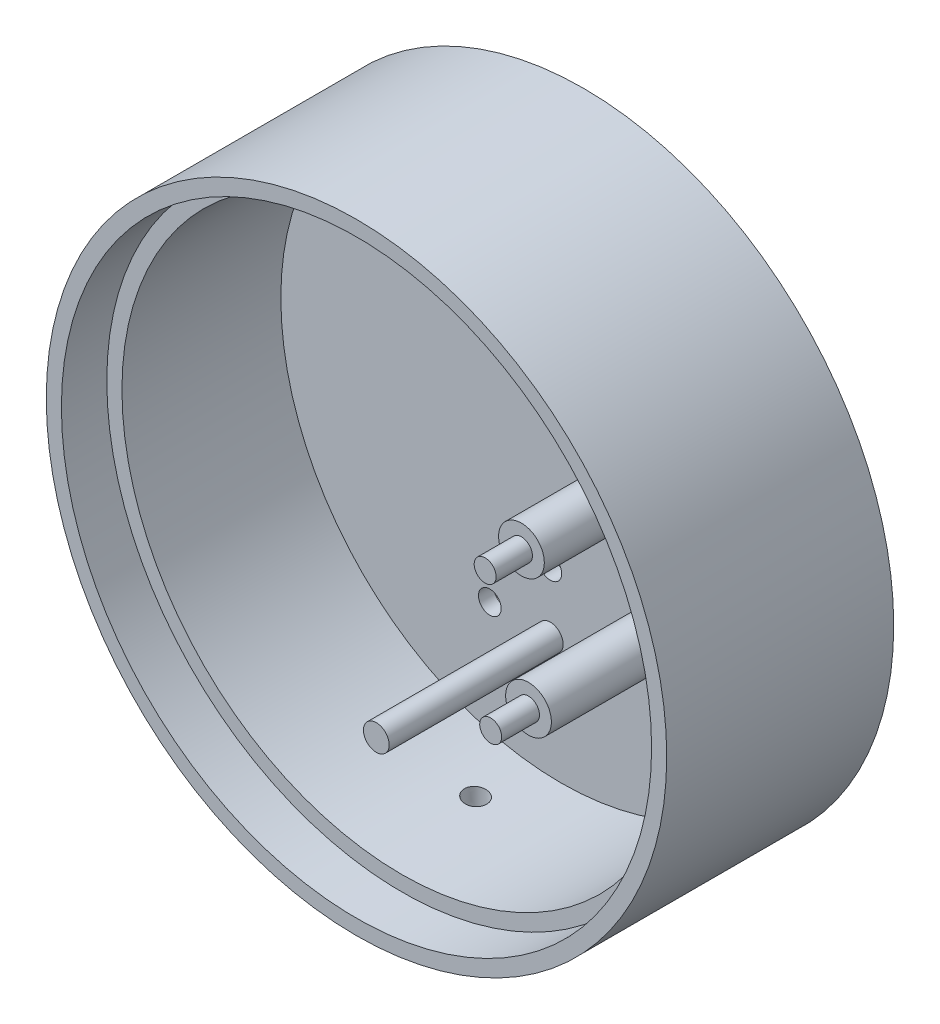
ISO-10303-21;
HEADER;
FILE_DESCRIPTION(('STEP AP214'),'2;1');
FILE_NAME('part.step','',(''),(''),'','','');
FILE_SCHEMA(('AUTOMOTIVE_DESIGN { 1 0 10303 214 1 1 1 1 }'));
ENDSEC;
DATA;
#1=APPLICATION_CONTEXT('core data for automotive mechanical design processes');
#2=APPLICATION_PROTOCOL_DEFINITION('international standard','automotive_design',2000,#1);
#3=PRODUCT_CONTEXT('',#1,'mechanical');
#4=PRODUCT('Part','Part','',(#3));
#5=PRODUCT_RELATED_PRODUCT_CATEGORY('part','',(#4));
#6=PRODUCT_DEFINITION_FORMATION('','',#4);
#7=PRODUCT_DEFINITION_CONTEXT('part definition',#1,'design');
#8=PRODUCT_DEFINITION('design','',#6,#7);
#9=PRODUCT_DEFINITION_SHAPE('','',#8);
#10=(LENGTH_UNIT() NAMED_UNIT(*) SI_UNIT(.MILLI.,.METRE.));
#11=(NAMED_UNIT(*) PLANE_ANGLE_UNIT() SI_UNIT($,.RADIAN.));
#12=(NAMED_UNIT(*) SI_UNIT($,.STERADIAN.) SOLID_ANGLE_UNIT());
#13=UNCERTAINTY_MEASURE_WITH_UNIT(LENGTH_MEASURE(1.E-05),#10,'distance_accuracy_value','');
#14=(GEOMETRIC_REPRESENTATION_CONTEXT(3) GLOBAL_UNCERTAINTY_ASSIGNED_CONTEXT((#13)) GLOBAL_UNIT_ASSIGNED_CONTEXT((#10,
#11,#12)) REPRESENTATION_CONTEXT('',''));
#15=CARTESIAN_POINT('',(0.,0.,0.));
#16=DIRECTION('',(0.,0.,1.));
#17=DIRECTION('',(1.,0.,0.));
#18=AXIS2_PLACEMENT_3D('',#15,#16,#17);
#19=CARTESIAN_POINT('',(0.,0.,30.));
#20=DIRECTION('',(0.,0.,-1.));
#21=DIRECTION('',(-1.,0.,0.));
#22=AXIS2_PLACEMENT_3D('',#19,#20,#21);
#23=CYLINDRICAL_SURFACE('',#22,41.);
#24=CARTESIAN_POINT('',(0.,0.,30.));
#25=DIRECTION('',(0.,0.,1.));
#26=DIRECTION('',(1.,0.,0.));
#27=AXIS2_PLACEMENT_3D('',#24,#25,#26);
#28=CIRCLE('',#27,41.);
#29=CARTESIAN_POINT('',(41.,0.,30.));
#30=VERTEX_POINT('',#29);
#31=EDGE_CURVE('E62',#30,#30,#28,.T.);
#32=ORIENTED_EDGE('',*,*,#31,.F.);
#33=EDGE_LOOP('',(#32));
#34=FACE_BOUND('',#33,.T.);
#35=CARTESIAN_POINT('',(0.,0.,0.));
#36=DIRECTION('',(0.,0.,1.));
#37=DIRECTION('',(1.,0.,0.));
#38=AXIS2_PLACEMENT_3D('',#35,#36,#37);
#39=CIRCLE('',#38,41.);
#40=CARTESIAN_POINT('',(41.,0.,0.));
#41=VERTEX_POINT('',#40);
#42=EDGE_CURVE('E141',#41,#41,#39,.T.);
#43=ORIENTED_EDGE('',*,*,#42,.T.);
#44=EDGE_LOOP('',(#43));
#45=FACE_BOUND('',#44,.T.);
#46=CARTESIAN_POINT('',(-2.37716467658597,-40.931028427104,10.4137086346441));
#47=CARTESIAN_POINT('',(-2.3771623971837,-40.9310284511238,10.3717192586367));
#48=CARTESIAN_POINT('',(-2.37889073852028,-40.9309281414088,10.329746946571));
#49=CARTESIAN_POINT('',(-2.38928220916009,-40.9303237648442,10.2039738746951));
#50=CARTESIAN_POINT('',(-2.40316975808611,-40.9295152008504,10.1205363014389));
#51=CARTESIAN_POINT('',(-2.44448005674494,-40.9270684764169,9.95730723749149));
#52=CARTESIAN_POINT('',(-2.47187756123256,-40.9254318631553,9.87750924841363));
#53=CARTESIAN_POINT('',(-2.53928052711791,-40.9213047530433,9.72408262746924));
#54=CARTESIAN_POINT('',(-2.5791989464474,-40.9188201410525,9.65041571773568));
#55=CARTESIAN_POINT('',(-2.6703102887617,-40.9129747375921,9.51132421389357));
#56=CARTESIAN_POINT('',(-2.72140769674994,-40.9096213270637,9.44583676221509));
#57=CARTESIAN_POINT('',(-2.83325525378671,-40.9020264981456,9.32480100142182));
#58=CARTESIAN_POINT('',(-2.89391858940833,-40.8977929664996,9.26917204182055));
#59=CARTESIAN_POINT('',(-3.02309162520389,-40.8884466493802,9.16918447918071));
#60=CARTESIAN_POINT('',(-3.09153574303989,-40.8833410538152,9.12474053635474));
#61=CARTESIAN_POINT('',(-3.23436214556599,-40.8722888207287,9.04810110652717));
#62=CARTESIAN_POINT('',(-3.30870508266276,-40.8663475805962,9.01583155996949));
#63=CARTESIAN_POINT('',(-3.46137228195058,-40.8536992414531,8.96420456445859));
#64=CARTESIAN_POINT('',(-3.53968044197045,-40.8469951205884,8.94479879528864));
#65=CARTESIAN_POINT('',(-3.69829646602468,-40.8329393204402,8.91928340327016));
#66=CARTESIAN_POINT('',(-3.77860224228909,-40.8255882984099,8.91316044369928));
#67=CARTESIAN_POINT('',(-3.93906944754786,-40.810418118415,8.9143339874341));
#68=CARTESIAN_POINT('',(-4.01923087785729,-40.8025989647377,8.92163036785733));
#69=CARTESIAN_POINT('',(-4.17720822656224,-40.7867286829846,8.94940002343128));
#70=CARTESIAN_POINT('',(-4.25502420601022,-40.7786775609575,8.96987295528351));
#71=CARTESIAN_POINT('',(-4.40621251656862,-40.762618592802,9.02337405445755));
#72=CARTESIAN_POINT('',(-4.47958501646807,-40.7546107450402,9.05640174452981));
#73=CARTESIAN_POINT('',(-4.619943731995,-40.7389385490923,9.13403507326682));
#74=CARTESIAN_POINT('',(-4.68693022837092,-40.7312741858134,9.17864020263036));
#75=CARTESIAN_POINT('',(-4.81282579759617,-40.7165903377375,9.27820688968569));
#76=CARTESIAN_POINT('',(-4.87173522771201,-40.7095708244219,9.33316798905453));
#77=CARTESIAN_POINT('',(-4.95286170306225,-40.6997531503153,9.42215355724027));
#78=CARTESIAN_POINT('',(-4.97870128755044,-40.6965987250306,9.4529117405157));
#79=CARTESIAN_POINT('',(-5.02785985428536,-40.6905546476847,9.51644911921834));
#80=CARTESIAN_POINT('',(-5.05117660347693,-40.6876652305311,9.54923006541931));
#81=CARTESIAN_POINT('',(-5.11763603799433,-40.6793782884215,9.65110580188371));
#82=CARTESIAN_POINT('',(-5.15662696943926,-40.6744427386298,9.72300809800538));
#83=CARTESIAN_POINT('',(-5.22255257164166,-40.6660307793524,9.8722242573391));
#84=CARTESIAN_POINT('',(-5.24948613464754,-40.6625545039371,9.94953861702166));
#85=CARTESIAN_POINT('',(-5.28061018950195,-40.6585201710797,10.0689460091167));
#86=CARTESIAN_POINT('',(-5.28948803442309,-40.6573655022343,10.109847041171));
#87=CARTESIAN_POINT('',(-5.30385510434942,-40.6554937584518,10.1922100948839));
#88=CARTESIAN_POINT('',(-5.30934740520797,-40.654776286317,10.2336715722546));
#89=CARTESIAN_POINT('',(-5.32069075693438,-40.65329417879,10.358555483994));
#90=CARTESIAN_POINT('',(-5.32141694373462,-40.6531987177451,10.4425108714224));
#91=CARTESIAN_POINT('',(-5.30914634308201,-40.6548028823739,10.6093540287983));
#92=CARTESIAN_POINT('',(-5.29614951753959,-40.6565025130301,10.6922417957821));
#93=CARTESIAN_POINT('',(-5.25677352408483,-40.6616124139497,10.8547344130826));
#94=CARTESIAN_POINT('',(-5.23039418558919,-40.6650227060185,10.9343392215385));
#95=CARTESIAN_POINT('',(-5.16497542737987,-40.6733832940348,11.0879420153035));
#96=CARTESIAN_POINT('',(-5.12595429336044,-40.678331365247,11.161947909571));
#97=CARTESIAN_POINT('',(-5.03647383611218,-40.6895065968907,11.302070250108));
#98=CARTESIAN_POINT('',(-4.98607155253496,-40.6957273647341,11.3682236115034));
#99=CARTESIAN_POINT('',(-4.87537244106547,-40.7091368791797,11.4908187098025));
#100=CARTESIAN_POINT('',(-4.81513696903969,-40.7163195766707,11.5473164827921));
#101=CARTESIAN_POINT('',(-4.68657706406967,-40.7313165506159,11.6491212629628));
#102=CARTESIAN_POINT('',(-4.61830913101037,-40.7391263057909,11.6945002425527));
#103=CARTESIAN_POINT('',(-4.4756609180233,-40.7550434799205,11.7729643258045));
#104=CARTESIAN_POINT('',(-4.4013239590787,-40.763148593773,11.8061286019149));
#105=CARTESIAN_POINT('',(-4.2485973380533,-40.7793486809919,11.8594368278455));
#106=CARTESIAN_POINT('',(-4.17023330354311,-40.787443446941,11.8796542047419));
#107=CARTESIAN_POINT('',(-4.01152531937639,-40.8033576642224,11.9066915835615));
#108=CARTESIAN_POINT('',(-3.93119060501075,-40.811178092281,11.9135651650779));
#109=CARTESIAN_POINT('',(-3.77058452554266,-40.826329585603,11.9138474115494));
#110=CARTESIAN_POINT('',(-3.69031327562182,-40.833661439309,11.9072783411759));
#111=CARTESIAN_POINT('',(-3.53191956964451,-40.8476666150801,11.8808963126063));
#112=CARTESIAN_POINT('',(-3.45379710413857,-40.8543399400413,11.8610834126609));
#113=CARTESIAN_POINT('',(-3.30185137902421,-40.8669009558953,11.8087916497526));
#114=CARTESIAN_POINT('',(-3.22802801689039,-40.8727886655278,11.7763130889838));
#115=CARTESIAN_POINT('',(-3.08667874348646,-40.8837063579864,11.6996407978586));
#116=CARTESIAN_POINT('',(-3.0191525769953,-40.8887363755811,11.65544754257));
#117=CARTESIAN_POINT('',(-2.89217621932528,-40.8979140746058,11.5566195361865));
#118=CARTESIAN_POINT('',(-2.83272560953991,-40.9020618017768,11.5019853266651));
#119=CARTESIAN_POINT('',(-2.72341222811634,-40.9094858692467,11.3838069769244));
#120=CARTESIAN_POINT('',(-2.67354891651546,-40.9127622586239,11.3202633388384));
#121=CARTESIAN_POINT('',(-2.58463087265841,-40.9184759411256,11.1859986411743));
#122=CARTESIAN_POINT('',(-2.54557555889166,-40.9209132793959,11.1152779680273));
#123=CARTESIAN_POINT('',(-2.4791928832257,-40.9249888911003,10.9685038678597));
#124=CARTESIAN_POINT('',(-2.45186499224826,-40.9266272005827,10.8924506815934));
#125=CARTESIAN_POINT('',(-2.41295019395358,-40.9289381994663,10.7494611280361));
#126=CARTESIAN_POINT('',(-2.39954442424727,-40.9297234409867,10.6830128116031));
#127=CARTESIAN_POINT('',(-2.3816561004512,-40.9307683823227,10.5489306611682));
#128=CARTESIAN_POINT('',(-2.37716834566425,-40.93102838844,10.4812975413361));
#129=CARTESIAN_POINT('',(-2.37716467658597,-40.931028427104,10.4137086346441));
#130=B_SPLINE_CURVE_WITH_KNOTS('',3,(#46,#47,#48,#49,#50,#51,#52,#53,#54,#55,#56,#57,#58,#59,
#60,#61,#62,#63,#64,#65,#66,#67,#68,#69,#70,#71,#72,#73,#74,#75,#76,#77,#78,#79,#80,#81,#82,#83,
#84,#85,#86,#87,#88,#89,#90,#91,#92,#93,#94,#95,#96,#97,#98,#99,#100,#101,#102,#103,#104,#105,
#106,#107,#108,#109,#110,#111,#112,#113,#114,#115,#116,#117,#118,#119,#120,#121,#122,#123,#124,
#125,#126,#127,#128,#129),.UNSPECIFIED.,.T.,.F.,(4,2,2,2,2,2,2,2,2,2,2,2,2,2,2,2,2,2,2,2,2,2,2,
2,2,2,2,2,2,2,2,2,2,2,2,2,2,2,2,2,2,4),(0.,0.125920881562001,0.378415016122451,
0.630439107837695,0.880748637745167,1.12899765782723,1.37511124865286,1.61928585213772,
1.86195017255385,2.1036977281542,2.34520244242334,2.58670494521665,2.82820115622057,
3.06968818804063,3.31116459844458,3.55263032436428,3.67340346574219,3.79428264815385,
4.03895998274571,4.28365979206833,4.40914064828536,4.53450733325827,4.78513817085038,
5.03576970409462,5.28640443215162,5.5366782368112,5.78572452207218,6.03327239984255,
6.27917284426694,6.52345014441489,6.76632948481489,7.00823155348009,7.24973329111297,
7.49123396655081,7.7327288802991,7.97421400216583,8.21568660157064,8.45714559710021,
8.69859159870891,8.9400267064277,9.14283568181152,9.34552635082659),.UNSPECIFIED.);
#131=CARTESIAN_POINT('',(-2.37716467658597,-40.931028427104,10.4137086346441));
#132=VERTEX_POINT('',#131);
#133=EDGE_CURVE('E298',#132,#132,#130,.T.);
#134=ORIENTED_EDGE('',*,*,#133,.T.);
#135=EDGE_LOOP('',(#134));
#136=FACE_BOUND('',#135,.T.);
#137=ADVANCED_FACE('F47',(#34,#45,#136),#23,.T.);
#138=CARTESIAN_POINT('',(0.,0.,24.));
#139=DIRECTION('',(0.,0.,-1.));
#140=DIRECTION('',(-1.,0.,0.));
#141=AXIS2_PLACEMENT_3D('',#138,#139,#140);
#142=CYLINDRICAL_SURFACE('',#141,37.);
#143=CARTESIAN_POINT('',(0.,0.,24.));
#144=DIRECTION('',(0.,0.,1.));
#145=DIRECTION('',(1.,0.,0.));
#146=AXIS2_PLACEMENT_3D('',#143,#144,#145);
#147=CIRCLE('',#146,37.);
#148=CARTESIAN_POINT('',(37.,0.,24.));
#149=VERTEX_POINT('',#148);
#150=EDGE_CURVE('E134',#149,#149,#147,.T.);
#151=ORIENTED_EDGE('',*,*,#150,.T.);
#152=EDGE_LOOP('',(#151));
#153=FACE_BOUND('',#152,.T.);
#154=CARTESIAN_POINT('',(0.,0.,3.));
#155=DIRECTION('',(0.,0.,1.));
#156=DIRECTION('',(1.,0.,0.));
#157=AXIS2_PLACEMENT_3D('',#154,#155,#156);
#158=CIRCLE('',#157,37.);
#159=CARTESIAN_POINT('',(37.,0.,3.));
#160=VERTEX_POINT('',#159);
#161=EDGE_CURVE('E12',#160,#160,#158,.T.);
#162=ORIENTED_EDGE('',*,*,#161,.F.);
#163=EDGE_LOOP('',(#162));
#164=FACE_BOUND('',#163,.T.);
#165=CARTESIAN_POINT('',(-2.37716467658597,-36.9235573597722,10.4137086346441));
#166=CARTESIAN_POINT('',(-2.37716271417179,-36.9235573779669,10.3717348926635));
#167=CARTESIAN_POINT('',(-2.3788896553615,-36.9234462635655,10.3297763583407));
#168=CARTESIAN_POINT('',(-2.38927359312985,-36.922776764497,10.2040456025513));
#169=CARTESIAN_POINT('',(-2.4031516678805,-36.9218810609903,10.1206374955645));
#170=CARTESIAN_POINT('',(-2.44443285583983,-36.9191706942836,9.95746408194085));
#171=CARTESIAN_POINT('',(-2.47181098644721,-36.9173577283677,9.87769234276516));
#172=CARTESIAN_POINT('',(-2.53916697514021,-36.9127858443964,9.72430986820282));
#173=CARTESIAN_POINT('',(-2.57905893940528,-36.9100333640597,9.65066133821899));
#174=CARTESIAN_POINT('',(-2.67011271795926,-36.9035575062899,9.51159431483901));
#175=CARTESIAN_POINT('',(-2.72118074123011,-36.8998421641621,9.44611405642221));
#176=CARTESIAN_POINT('',(-2.83297073939447,-36.891426978505,9.32507761129766));
#177=CARTESIAN_POINT('',(-2.89360816267674,-36.8867356525065,9.26944280436401));
#178=CARTESIAN_POINT('',(-3.02273840206351,-36.8763773762121,9.16942781241244));
#179=CARTESIAN_POINT('',(-3.09116821617957,-36.8707180876059,9.12496554466447));
#180=CARTESIAN_POINT('',(-3.23398354905525,-36.8584651127971,9.048276773632));
#181=CARTESIAN_POINT('',(-3.30833221054481,-36.8518770382874,9.01598077743316));
#182=CARTESIAN_POINT('',(-3.46103509539099,-36.8378486117338,8.96429565495821));
#183=CARTESIAN_POINT('',(-3.53937511838574,-36.8304111782741,8.94486380149455));
#184=CARTESIAN_POINT('',(-3.69808098620725,-36.8148142551436,8.9193022393244));
#185=CARTESIAN_POINT('',(-3.77844566980221,-36.8066551729184,8.91316507366161));
#186=CARTESIAN_POINT('',(-3.93902057343224,-36.7898169897099,8.91432786231537));
#187=CARTESIAN_POINT('',(-4.01923079529094,-36.7811378949054,8.92162765700613));
#188=CARTESIAN_POINT('',(-4.17729757149612,-36.7635214810976,8.94941842671122));
#189=CARTESIAN_POINT('',(-4.25515419097057,-36.754584169253,8.96990903636397));
#190=CARTESIAN_POINT('',(-4.40641672586458,-36.7367567441652,9.02345625610048));
#191=CARTESIAN_POINT('',(-4.47982281040511,-36.7278666291401,9.05651238834511));
#192=CARTESIAN_POINT('',(-4.62025214938032,-36.7104655668306,9.13422662951711));
#193=CARTESIAN_POINT('',(-4.68727567238551,-36.7019546036,9.17888424997275));
#194=CARTESIAN_POINT('',(-4.81321805473752,-36.6856507459434,9.27854641786288));
#195=CARTESIAN_POINT('',(-4.87213724271229,-36.6778578224054,9.33355054553585));
#196=CARTESIAN_POINT('',(-4.98039024215024,-36.6633154853591,9.45240784599249));
#197=CARTESIAN_POINT('',(-5.02972438905974,-36.6565660353342,9.51626070896419));
#198=CARTESIAN_POINT('',(-5.11758896699633,-36.6444027962827,9.65111981000824));
#199=CARTESIAN_POINT('',(-5.15611969320282,-36.6389889707638,9.72212585256383));
#200=CARTESIAN_POINT('',(-5.22143724016742,-36.6297377282479,9.86944040049489));
#201=CARTESIAN_POINT('',(-5.24822428622059,-36.6259002810094,9.94574880411539));
#202=CARTESIAN_POINT('',(-5.2894061134526,-36.6199756818038,10.1017017581762));
#203=CARTESIAN_POINT('',(-5.30380103863482,-36.6178885094976,10.1813462698379));
#204=CARTESIAN_POINT('',(-5.31984978648091,-36.6155604270779,10.3419369565512));
#205=CARTESIAN_POINT('',(-5.3215036718657,-36.6153195078757,10.4228831251932));
#206=CARTESIAN_POINT('',(-5.31203629832251,-36.6166941726344,10.5839995938832));
#207=CARTESIAN_POINT('',(-5.30091502340757,-36.6183097589185,10.66416989296));
#208=CARTESIAN_POINT('',(-5.26614442489883,-36.6233263138505,10.8217291838974));
#209=CARTESIAN_POINT('',(-5.24249500648972,-36.6267272960105,10.8991181547036));
#210=CARTESIAN_POINT('',(-5.19810868270545,-36.6330435942676,11.0115150130964));
#211=CARTESIAN_POINT('',(-5.18182412532248,-36.6353520250639,11.0483725292445));
#212=CARTESIAN_POINT('',(-5.14636453340583,-36.6403500802995,11.1206857588619));
#213=CARTESIAN_POINT('',(-5.12718685589277,-36.6430400531569,11.1561401527488));
#214=CARTESIAN_POINT('',(-5.06496097127197,-36.6517113272265,11.2608925242604));
#215=CARTESIAN_POINT('',(-5.01759052451856,-36.6582405902685,11.3276396906477));
#216=CARTESIAN_POINT('',(-4.91265586659724,-36.6724501651519,11.4524348660254));
#217=CARTESIAN_POINT('',(-4.85509178223605,-36.6801304626745,11.5104829832135));
#218=CARTESIAN_POINT('',(-4.76180562963885,-36.6923181899025,11.5902055530761));
#219=CARTESIAN_POINT('',(-4.72926699001965,-36.6965281129651,11.6157271666187));
#220=CARTESIAN_POINT('',(-4.66220613453742,-36.7051083302985,11.6639144718032));
#221=CARTESIAN_POINT('',(-4.62768574973725,-36.7094784752221,11.6865827399112));
#222=CARTESIAN_POINT('',(-4.52247298784255,-36.7226382958959,11.7494628279695));
#223=CARTESIAN_POINT('',(-4.44916323144803,-36.7316044673991,11.7853725701244));
#224=CARTESIAN_POINT('',(-4.29806521048729,-36.7495903701681,11.8442489655035));
#225=CARTESIAN_POINT('',(-4.2203057586637,-36.7586094781549,11.8672903523326));
#226=CARTESIAN_POINT('',(-4.0623620930821,-36.7763986027129,11.9000026224893));
#227=CARTESIAN_POINT('',(-3.98219073266402,-36.7851695771154,11.9097347489451));
#228=CARTESIAN_POINT('',(-3.82150258412264,-36.8022095762224,11.9156934454065));
#229=CARTESIAN_POINT('',(-3.74098719645508,-36.8104798228351,11.9119543609791));
#230=CARTESIAN_POINT('',(-3.58162967486224,-36.8263267493941,11.8911334482267));
#231=CARTESIAN_POINT('',(-3.50278754559527,-36.8339034274097,11.8740515827607));
#232=CARTESIAN_POINT('',(-3.34895732629295,-36.8482083244286,11.8270347218515));
#233=CARTESIAN_POINT('',(-3.27396917164101,-36.85493655766,11.797099941982));
#234=CARTESIAN_POINT('',(-3.12989193857024,-36.8674519202014,11.725247732099));
#235=CARTESIAN_POINT('',(-3.06080265546402,-36.8732390821724,11.6833307180817));
#236=CARTESIAN_POINT('',(-2.93037140732863,-36.8838340250799,11.5887369934332));
#237=CARTESIAN_POINT('',(-2.86902907061677,-36.8886418530097,11.536060799323));
#238=CARTESIAN_POINT('',(-2.75564912510584,-36.897284956876,11.4213960992488));
#239=CARTESIAN_POINT('',(-2.70361100787976,-36.9011202859592,11.3594081024668));
#240=CARTESIAN_POINT('',(-2.63356285805986,-36.9061633783724,11.2608219339488));
#241=CARTESIAN_POINT('',(-2.61154559204897,-36.9077262747324,11.2270203197484));
#242=CARTESIAN_POINT('',(-2.57026707297282,-36.9106238660287,11.157723143987));
#243=CARTESIAN_POINT('',(-2.55100834148069,-36.9119583523902,11.1222260716291));
#244=CARTESIAN_POINT('',(-2.49713901948488,-36.9156554147511,11.0126609120286));
#245=CARTESIAN_POINT('',(-2.46700388788924,-36.9176713366705,10.9363196354663));
#246=CARTESIAN_POINT('',(-2.41939204458254,-36.9208222480713,10.7798170538286));
#247=CARTESIAN_POINT('',(-2.40191409767279,-36.9219573235143,10.6996561223225));
#248=CARTESIAN_POINT('',(-2.38177318943043,-36.9232614803444,10.5507113280389));
#249=CARTESIAN_POINT('',(-2.37716787830896,-36.9235573300873,10.4821897409694));
#250=CARTESIAN_POINT('',(-2.37716467658597,-36.9235573597722,10.4137086346441));
#251=B_SPLINE_CURVE_WITH_KNOTS('',3,(#165,#166,#167,#168,#169,#170,#171,#172,#173,#174,#175,
#176,#177,#178,#179,#180,#181,#182,#183,#184,#185,#186,#187,#188,#189,#190,#191,#192,#193,#194,
#195,#196,#197,#198,#199,#200,#201,#202,#203,#204,#205,#206,#207,#208,#209,#210,#211,#212,#213,
#214,#215,#216,#217,#218,#219,#220,#221,#222,#223,#224,#225,#226,#227,#228,#229,#230,#231,#232,
#233,#234,#235,#236,#237,#238,#239,#240,#241,#242,#243,#244,#245,#246,#247,#248,#249,#250),
.UNSPECIFIED.,.T.,.F.,(4,2,2,2,2,2,2,2,2,2,2,2,2,2,2,2,2,2,2,2,2,2,2,2,2,2,2,2,2,2,2,2,2,2,2,2,
2,2,2,2,2,2,4),(0.,0.125877356085569,0.378284248894425,0.630225791885029,0.880474534461168,
1.12869861605412,1.37484103820202,1.61911842726084,1.86197856577792,2.10402796241475,
2.3459415589749,2.5878522817157,2.82975630425792,3.07165112864321,3.31353576988357,
3.55541059989284,3.79727696351773,4.03913671803872,4.28099183243037,4.52284413629224,
4.76469524957562,5.00654666551435,5.2483999118555,5.36937028115445,5.49045183846915,
5.73561458877269,5.9807742895173,6.10534706839655,6.22980654317309,6.47494813991078,
6.71865085314831,6.96122834132997,7.20318780348839,7.44514793916793,7.68710401676528,
7.92905169521309,8.17098776109133,8.41291060238333,8.53390858133001,8.65501646802656,
8.90014646630251,9.14525253942594,9.35062428374265),.UNSPECIFIED.);
#252=CARTESIAN_POINT('',(-2.37716467658597,-36.9235573597722,10.4137086346441));
#253=VERTEX_POINT('',#252);
#254=EDGE_CURVE('E291',#253,#253,#251,.T.);
#255=ORIENTED_EDGE('',*,*,#254,.F.);
#256=EDGE_LOOP('',(#255));
#257=FACE_BOUND('',#256,.T.);
#258=ADVANCED_FACE('F174',(#153,#164,#257),#142,.F.);
#259=CARTESIAN_POINT('',(-1.38249356231057,-29.,0.));
#260=DIRECTION('',(0.,0.,1.));
#261=DIRECTION('',(1.,0.,0.));
#262=AXIS2_PLACEMENT_3D('',#259,#260,#261);
#263=CYLINDRICAL_SURFACE('',#262,1.5);
#264=CARTESIAN_POINT('',(-1.38249356231057,-29.,3.));
#265=DIRECTION('',(0.,0.,1.));
#266=DIRECTION('',(1.,0.,0.));
#267=AXIS2_PLACEMENT_3D('',#264,#265,#266);
#268=CIRCLE('',#267,1.5);
#269=CARTESIAN_POINT('',(0.11750643768943,-29.,3.));
#270=VERTEX_POINT('',#269);
#271=EDGE_CURVE('E93',#270,#270,#268,.T.);
#272=ORIENTED_EDGE('',*,*,#271,.T.);
#273=EDGE_LOOP('',(#272));
#274=FACE_BOUND('',#273,.T.);
#275=CARTESIAN_POINT('',(-1.38249356231057,-29.,1.));
#276=DIRECTION('',(0.,0.,-1.));
#277=DIRECTION('',(-1.,0.,0.));
#278=AXIS2_PLACEMENT_3D('',#275,#276,#277);
#279=CIRCLE('',#278,1.5);
#280=CARTESIAN_POINT('',(-2.88249356231057,-29.,1.));
#281=VERTEX_POINT('',#280);
#282=EDGE_CURVE('E51',#281,#281,#279,.F.);
#283=ORIENTED_EDGE('',*,*,#282,.F.);
#284=EDGE_LOOP('',(#283));
#285=FACE_BOUND('',#284,.T.);
#286=ADVANCED_FACE('F180',(#274,#285),#263,.F.);
#287=CARTESIAN_POINT('',(-9.38249356231057,-21.,0.));
#288=DIRECTION('',(0.,0.,1.));
#289=DIRECTION('',(1.,0.,0.));
#290=AXIS2_PLACEMENT_3D('',#287,#288,#289);
#291=CYLINDRICAL_SURFACE('',#290,1.5);
#292=CARTESIAN_POINT('',(-9.38249356231057,-21.,3.));
#293=DIRECTION('',(0.,0.,1.));
#294=DIRECTION('',(1.,0.,0.));
#295=AXIS2_PLACEMENT_3D('',#292,#293,#294);
#296=CIRCLE('',#295,1.5);
#297=CARTESIAN_POINT('',(-7.88249356231057,-21.,3.));
#298=VERTEX_POINT('',#297);
#299=EDGE_CURVE('E98',#298,#298,#296,.T.);
#300=ORIENTED_EDGE('',*,*,#299,.T.);
#301=EDGE_LOOP('',(#300));
#302=FACE_BOUND('',#301,.T.);
#303=CARTESIAN_POINT('',(-9.38249356231057,-21.,1.));
#304=DIRECTION('',(0.,0.,-1.));
#305=DIRECTION('',(-1.,0.,0.));
#306=AXIS2_PLACEMENT_3D('',#303,#304,#305);
#307=CIRCLE('',#306,1.5);
#308=CARTESIAN_POINT('',(-10.8824935623106,-21.,1.));
#309=VERTEX_POINT('',#308);
#310=EDGE_CURVE('E86',#309,#309,#307,.F.);
#311=ORIENTED_EDGE('',*,*,#310,.F.);
#312=EDGE_LOOP('',(#311));
#313=FACE_BOUND('',#312,.T.);
#314=ADVANCED_FACE('F189',(#302,#313),#291,.F.);
#315=CARTESIAN_POINT('',(-1.38249356231057,-13.,0.));
#316=DIRECTION('',(0.,0.,1.));
#317=DIRECTION('',(1.,0.,0.));
#318=AXIS2_PLACEMENT_3D('',#315,#316,#317);
#319=CYLINDRICAL_SURFACE('',#318,1.5);
#320=CARTESIAN_POINT('',(-1.38249356231057,-13.,3.));
#321=DIRECTION('',(0.,0.,1.));
#322=DIRECTION('',(1.,0.,0.));
#323=AXIS2_PLACEMENT_3D('',#320,#321,#322);
#324=CIRCLE('',#323,1.5);
#325=CARTESIAN_POINT('',(0.117506437689427,-13.,3.));
#326=VERTEX_POINT('',#325);
#327=EDGE_CURVE('E104',#326,#326,#324,.T.);
#328=ORIENTED_EDGE('',*,*,#327,.T.);
#329=EDGE_LOOP('',(#328));
#330=FACE_BOUND('',#329,.T.);
#331=CARTESIAN_POINT('',(-1.38249356231057,-13.,1.));
#332=DIRECTION('',(0.,0.,-1.));
#333=DIRECTION('',(-1.,0.,0.));
#334=AXIS2_PLACEMENT_3D('',#331,#332,#333);
#335=CIRCLE('',#334,1.5);
#336=CARTESIAN_POINT('',(-2.88249356231057,-13.,1.));
#337=VERTEX_POINT('',#336);
#338=EDGE_CURVE('E82',#337,#337,#335,.F.);
#339=ORIENTED_EDGE('',*,*,#338,.F.);
#340=EDGE_LOOP('',(#339));
#341=FACE_BOUND('',#340,.T.);
#342=ADVANCED_FACE('F239',(#330,#341),#319,.F.);
#343=CARTESIAN_POINT('',(6.61750643768943,-21.,0.));
#344=DIRECTION('',(0.,0.,1.));
#345=DIRECTION('',(1.,0.,0.));
#346=AXIS2_PLACEMENT_3D('',#343,#344,#345);
#347=CYLINDRICAL_SURFACE('',#346,1.5);
#348=CARTESIAN_POINT('',(6.61750643768943,-21.,3.));
#349=DIRECTION('',(0.,0.,1.));
#350=DIRECTION('',(1.,0.,0.));
#351=AXIS2_PLACEMENT_3D('',#348,#349,#350);
#352=CIRCLE('',#351,1.5);
#353=CARTESIAN_POINT('',(8.11750643768943,-21.,3.));
#354=VERTEX_POINT('',#353);
#355=EDGE_CURVE('E115',#354,#354,#352,.T.);
#356=ORIENTED_EDGE('',*,*,#355,.T.);
#357=EDGE_LOOP('',(#356));
#358=FACE_BOUND('',#357,.T.);
#359=CARTESIAN_POINT('',(6.61750643768943,-21.,1.));
#360=DIRECTION('',(0.,0.,-1.));
#361=DIRECTION('',(-1.,0.,0.));
#362=AXIS2_PLACEMENT_3D('',#359,#360,#361);
#363=CIRCLE('',#362,1.5);
#364=CARTESIAN_POINT('',(5.11750643768943,-21.,1.));
#365=VERTEX_POINT('',#364);
#366=EDGE_CURVE('E78',#365,#365,#363,.F.);
#367=ORIENTED_EDGE('',*,*,#366,.F.);
#368=EDGE_LOOP('',(#367));
#369=FACE_BOUND('',#368,.T.);
#370=ADVANCED_FACE('F243',(#358,#369),#347,.F.);
#371=CARTESIAN_POINT('',(0.,0.,30.));
#372=DIRECTION('',(0.,0.,-1.));
#373=DIRECTION('',(-1.,0.,0.));
#374=AXIS2_PLACEMENT_3D('',#371,#372,#373);
#375=CYLINDRICAL_SURFACE('',#374,39.);
#376=CARTESIAN_POINT('',(0.,0.,24.));
#377=DIRECTION('',(0.,0.,1.));
#378=DIRECTION('',(1.,0.,0.));
#379=AXIS2_PLACEMENT_3D('',#376,#377,#378);
#380=CIRCLE('',#379,39.);
#381=CARTESIAN_POINT('',(39.,0.,24.));
#382=VERTEX_POINT('',#381);
#383=EDGE_CURVE('E56',#382,#382,#380,.T.);
#384=ORIENTED_EDGE('',*,*,#383,.F.);
#385=EDGE_LOOP('',(#384));
#386=FACE_BOUND('',#385,.T.);
#387=CARTESIAN_POINT('',(0.,0.,30.));
#388=DIRECTION('',(0.,0.,1.));
#389=DIRECTION('',(1.,0.,0.));
#390=AXIS2_PLACEMENT_3D('',#387,#388,#389);
#391=CIRCLE('',#390,39.);
#392=CARTESIAN_POINT('',(39.,0.,30.));
#393=VERTEX_POINT('',#392);
#394=EDGE_CURVE('E142',#393,#393,#391,.T.);
#395=ORIENTED_EDGE('',*,*,#394,.T.);
#396=EDGE_LOOP('',(#395));
#397=FACE_BOUND('',#396,.T.);
#398=ADVANCED_FACE('F49',(#386,#397),#375,.F.);
#399=CARTESIAN_POINT('',(0.,0.,30.));
#400=DIRECTION('',(0.,0.,1.));
#401=DIRECTION('',(1.,0.,0.));
#402=AXIS2_PLACEMENT_3D('',#399,#400,#401);
#403=PLANE('',#402);
#404=ORIENTED_EDGE('',*,*,#394,.F.);
#405=EDGE_LOOP('',(#404));
#406=FACE_BOUND('',#405,.T.);
#407=ORIENTED_EDGE('',*,*,#31,.T.);
#408=EDGE_LOOP('',(#407));
#409=FACE_BOUND('',#408,.T.);
#410=ADVANCED_FACE('F157',(#406,#409),#403,.T.);
#411=CARTESIAN_POINT('',(0.,0.,0.));
#412=DIRECTION('',(0.,0.,1.));
#413=DIRECTION('',(1.,0.,0.));
#414=AXIS2_PLACEMENT_3D('',#411,#412,#413);
#415=PLANE('',#414);
#416=CARTESIAN_POINT('',(-1.38249356231057,-13.,0.));
#417=DIRECTION('',(0.,0.,-1.));
#418=DIRECTION('',(-1.,0.,0.));
#419=AXIS2_PLACEMENT_3D('',#416,#417,#418);
#420=CIRCLE('',#419,3.);
#421=CARTESIAN_POINT('',(-4.38249356231057,-13.,0.));
#422=VERTEX_POINT('',#421);
#423=EDGE_CURVE('E309',#422,#422,#420,.T.);
#424=ORIENTED_EDGE('',*,*,#423,.F.);
#425=EDGE_LOOP('',(#424));
#426=FACE_BOUND('',#425,.T.);
#427=CARTESIAN_POINT('',(-9.38249356231057,-21.,0.));
#428=DIRECTION('',(0.,0.,-1.));
#429=DIRECTION('',(-1.,0.,0.));
#430=AXIS2_PLACEMENT_3D('',#427,#428,#429);
#431=CIRCLE('',#430,3.);
#432=CARTESIAN_POINT('',(-12.3824935623106,-21.,0.));
#433=VERTEX_POINT('',#432);
#434=EDGE_CURVE('E317',#433,#433,#431,.T.);
#435=ORIENTED_EDGE('',*,*,#434,.F.);
#436=EDGE_LOOP('',(#435));
#437=FACE_BOUND('',#436,.T.);
#438=CARTESIAN_POINT('',(-1.38249356231057,-29.,0.));
#439=DIRECTION('',(0.,0.,-1.));
#440=DIRECTION('',(-1.,0.,0.));
#441=AXIS2_PLACEMENT_3D('',#438,#439,#440);
#442=CIRCLE('',#441,3.);
#443=CARTESIAN_POINT('',(-4.38249356231057,-29.,0.));
#444=VERTEX_POINT('',#443);
#445=EDGE_CURVE('E325',#444,#444,#442,.T.);
#446=ORIENTED_EDGE('',*,*,#445,.F.);
#447=EDGE_LOOP('',(#446));
#448=FACE_BOUND('',#447,.T.);
#449=CARTESIAN_POINT('',(6.61750643768943,-21.,0.));
#450=DIRECTION('',(0.,0.,-1.));
#451=DIRECTION('',(-1.,0.,0.));
#452=AXIS2_PLACEMENT_3D('',#449,#450,#451);
#453=CIRCLE('',#452,3.);
#454=CARTESIAN_POINT('',(3.61750643768943,-21.,0.));
#455=VERTEX_POINT('',#454);
#456=EDGE_CURVE('E297',#455,#455,#453,.T.);
#457=ORIENTED_EDGE('',*,*,#456,.F.);
#458=EDGE_LOOP('',(#457));
#459=FACE_BOUND('',#458,.T.);
#460=ORIENTED_EDGE('',*,*,#42,.F.);
#461=EDGE_LOOP('',(#460));
#462=FACE_BOUND('',#461,.T.);
#463=ADVANCED_FACE('F154',(#426,#437,#448,#459,#462),#415,.F.);
#464=CARTESIAN_POINT('',(0.,0.,24.));
#465=DIRECTION('',(0.,0.,1.));
#466=DIRECTION('',(1.,0.,0.));
#467=AXIS2_PLACEMENT_3D('',#464,#465,#466);
#468=PLANE('',#467);
#469=ORIENTED_EDGE('',*,*,#383,.T.);
#470=EDGE_LOOP('',(#469));
#471=FACE_BOUND('',#470,.T.);
#472=ORIENTED_EDGE('',*,*,#150,.F.);
#473=EDGE_LOOP('',(#472));
#474=FACE_BOUND('',#473,.T.);
#475=ADVANCED_FACE('F156',(#471,#474),#468,.T.);
#476=CARTESIAN_POINT('',(0.,0.,3.));
#477=DIRECTION('',(0.,0.,1.));
#478=DIRECTION('',(1.,0.,0.));
#479=AXIS2_PLACEMENT_3D('',#476,#477,#478);
#480=PLANE('',#479);
#481=ORIENTED_EDGE('',*,*,#355,.F.);
#482=EDGE_LOOP('',(#481));
#483=FACE_BOUND('',#482,.T.);
#484=ORIENTED_EDGE('',*,*,#327,.F.);
#485=EDGE_LOOP('',(#484));
#486=FACE_BOUND('',#485,.T.);
#487=ORIENTED_EDGE('',*,*,#299,.F.);
#488=EDGE_LOOP('',(#487));
#489=FACE_BOUND('',#488,.T.);
#490=ORIENTED_EDGE('',*,*,#271,.F.);
#491=EDGE_LOOP('',(#490));
#492=FACE_BOUND('',#491,.T.);
#493=CARTESIAN_POINT('',(17.,9.30714148132601,3.));
#494=DIRECTION('',(0.,0.,1.));
#495=DIRECTION('',(1.,0.,0.));
#496=AXIS2_PLACEMENT_3D('',#493,#494,#495);
#497=CIRCLE('',#496,3.02247291172559);
#498=CARTESIAN_POINT('',(20.0224729117256,9.30714148132601,3.));
#499=VERTEX_POINT('',#498);
#500=EDGE_CURVE('E111',#499,#499,#497,.T.);
#501=ORIENTED_EDGE('',*,*,#500,.F.);
#502=EDGE_LOOP('',(#501));
#503=FACE_BOUND('',#502,.T.);
#504=CARTESIAN_POINT('',(15.7327864941309,-10.6526723938218,3.));
#505=DIRECTION('',(0.,0.,1.));
#506=DIRECTION('',(1.,0.,0.));
#507=AXIS2_PLACEMENT_3D('',#504,#505,#506);
#508=CIRCLE('',#507,3.02247291172559);
#509=CARTESIAN_POINT('',(18.7552594058565,-10.6526723938218,3.));
#510=VERTEX_POINT('',#509);
#511=EDGE_CURVE('E119',#510,#510,#508,.T.);
#512=ORIENTED_EDGE('',*,*,#511,.F.);
#513=EDGE_LOOP('',(#512));
#514=FACE_BOUND('',#513,.T.);
#515=CARTESIAN_POINT('',(-1.38249356231057,-21.,3.));
#516=DIRECTION('',(0.,0.,1.));
#517=DIRECTION('',(1.,0.,0.));
#518=AXIS2_PLACEMENT_3D('',#515,#516,#517);
#519=CIRCLE('',#518,1.7);
#520=CARTESIAN_POINT('',(0.317506437689428,-21.,3.));
#521=VERTEX_POINT('',#520);
#522=EDGE_CURVE('E129',#521,#521,#519,.T.);
#523=ORIENTED_EDGE('',*,*,#522,.F.);
#524=EDGE_LOOP('',(#523));
#525=FACE_BOUND('',#524,.T.);
#526=ORIENTED_EDGE('',*,*,#161,.T.);
#527=EDGE_LOOP('',(#526));
#528=FACE_BOUND('',#527,.T.);
#529=ADVANCED_FACE('F165',(#483,#486,#489,#492,#503,#514,#525,#528),#480,.T.);
#530=CARTESIAN_POINT('',(-1.38249356231057,-21.,26.));
#531=DIRECTION('',(0.,0.,-1.));
#532=DIRECTION('',(-1.,0.,0.));
#533=AXIS2_PLACEMENT_3D('',#530,#531,#532);
#534=CYLINDRICAL_SURFACE('',#533,1.7);
#535=CARTESIAN_POINT('',(-1.38249356231057,-21.,26.));
#536=DIRECTION('',(0.,0.,1.));
#537=DIRECTION('',(1.,0.,0.));
#538=AXIS2_PLACEMENT_3D('',#535,#536,#537);
#539=CIRCLE('',#538,1.7);
#540=CARTESIAN_POINT('',(0.317506437689428,-21.,26.));
#541=VERTEX_POINT('',#540);
#542=EDGE_CURVE('E130',#541,#541,#539,.T.);
#543=ORIENTED_EDGE('',*,*,#542,.F.);
#544=EDGE_LOOP('',(#543));
#545=FACE_BOUND('',#544,.T.);
#546=ORIENTED_EDGE('',*,*,#522,.T.);
#547=EDGE_LOOP('',(#546));
#548=FACE_BOUND('',#547,.T.);
#549=ADVANCED_FACE('F195',(#545,#548),#534,.T.);
#550=CARTESIAN_POINT('',(-1.38249356231057,-21.,26.));
#551=DIRECTION('',(0.,0.,1.));
#552=DIRECTION('',(1.,0.,0.));
#553=AXIS2_PLACEMENT_3D('',#550,#551,#552);
#554=PLANE('',#553);
#555=ORIENTED_EDGE('',*,*,#542,.T.);
#556=EDGE_LOOP('',(#555));
#557=FACE_BOUND('',#556,.T.);
#558=ADVANCED_FACE('F199',(#557),#554,.T.);
#559=CARTESIAN_POINT('',(15.7327864941309,-10.6526723938218,23.));
#560=DIRECTION('',(0.,0.,-1.));
#561=DIRECTION('',(-1.,0.,0.));
#562=AXIS2_PLACEMENT_3D('',#559,#560,#561);
#563=CYLINDRICAL_SURFACE('',#562,3.02247291172559);
#564=CARTESIAN_POINT('',(15.7327864941309,-10.6526723938218,23.));
#565=DIRECTION('',(0.,0.,1.));
#566=DIRECTION('',(1.,0.,0.));
#567=AXIS2_PLACEMENT_3D('',#564,#565,#566);
#568=CIRCLE('',#567,3.02247291172559);
#569=CARTESIAN_POINT('',(18.7552594058565,-10.6526723938218,23.));
#570=VERTEX_POINT('',#569);
#571=EDGE_CURVE('E71',#570,#570,#568,.T.);
#572=ORIENTED_EDGE('',*,*,#571,.F.);
#573=EDGE_LOOP('',(#572));
#574=FACE_BOUND('',#573,.T.);
#575=ORIENTED_EDGE('',*,*,#511,.T.);
#576=EDGE_LOOP('',(#575));
#577=FACE_BOUND('',#576,.T.);
#578=ADVANCED_FACE('F203',(#574,#577),#563,.T.);
#579=CARTESIAN_POINT('',(15.7327864941309,-10.6526723938218,23.));
#580=DIRECTION('',(0.,0.,1.));
#581=DIRECTION('',(1.,0.,0.));
#582=AXIS2_PLACEMENT_3D('',#579,#580,#581);
#583=PLANE('',#582);
#584=CARTESIAN_POINT('',(15.7327864941309,-10.6526723938218,23.));
#585=DIRECTION('',(0.,0.,1.));
#586=DIRECTION('',(1.,0.,0.));
#587=AXIS2_PLACEMENT_3D('',#584,#585,#586);
#588=CIRCLE('',#587,1.45);
#589=CARTESIAN_POINT('',(17.1827864941309,-10.6526723938218,23.));
#590=VERTEX_POINT('',#589);
#591=EDGE_CURVE('E66',#590,#590,#588,.T.);
#592=ORIENTED_EDGE('',*,*,#591,.F.);
#593=EDGE_LOOP('',(#592));
#594=FACE_BOUND('',#593,.T.);
#595=ORIENTED_EDGE('',*,*,#571,.T.);
#596=EDGE_LOOP('',(#595));
#597=FACE_BOUND('',#596,.T.);
#598=ADVANCED_FACE('F213',(#594,#597),#583,.T.);
#599=CARTESIAN_POINT('',(15.7327864941309,-10.6526723938218,28.));
#600=DIRECTION('',(0.,0.,1.));
#601=DIRECTION('',(1.,0.,0.));
#602=AXIS2_PLACEMENT_3D('',#599,#600,#601);
#603=PLANE('',#602);
#604=CARTESIAN_POINT('',(15.7327864941309,-10.6526723938218,28.));
#605=DIRECTION('',(0.,0.,1.));
#606=DIRECTION('',(1.,0.,0.));
#607=AXIS2_PLACEMENT_3D('',#604,#605,#606);
#608=CIRCLE('',#607,1.45);
#609=CARTESIAN_POINT('',(17.1827864941309,-10.6526723938218,28.));
#610=VERTEX_POINT('',#609);
#611=EDGE_CURVE('E70',#610,#610,#608,.T.);
#612=ORIENTED_EDGE('',*,*,#611,.T.);
#613=EDGE_LOOP('',(#612));
#614=FACE_BOUND('',#613,.T.);
#615=ADVANCED_FACE('F209',(#614),#603,.T.);
#616=CARTESIAN_POINT('',(15.7327864941309,-10.6526723938218,28.));
#617=DIRECTION('',(0.,0.,-1.));
#618=DIRECTION('',(-1.,0.,0.));
#619=AXIS2_PLACEMENT_3D('',#616,#617,#618);
#620=CYLINDRICAL_SURFACE('',#619,1.45);
#621=ORIENTED_EDGE('',*,*,#591,.T.);
#622=EDGE_LOOP('',(#621));
#623=FACE_BOUND('',#622,.T.);
#624=ORIENTED_EDGE('',*,*,#611,.F.);
#625=EDGE_LOOP('',(#624));
#626=FACE_BOUND('',#625,.T.);
#627=ADVANCED_FACE('F205',(#623,#626),#620,.T.);
#628=CARTESIAN_POINT('',(17.,9.30714148132601,25.2));
#629=DIRECTION('',(0.,0.,-1.));
#630=DIRECTION('',(-1.,0.,0.));
#631=AXIS2_PLACEMENT_3D('',#628,#629,#630);
#632=CYLINDRICAL_SURFACE('',#631,3.02247291172559);
#633=CARTESIAN_POINT('',(17.,9.30714148132601,25.2));
#634=DIRECTION('',(0.,0.,1.));
#635=DIRECTION('',(1.,0.,0.));
#636=AXIS2_PLACEMENT_3D('',#633,#634,#635);
#637=CIRCLE('',#636,3.02247291172559);
#638=CARTESIAN_POINT('',(20.0224729117256,9.30714148132601,25.2));
#639=VERTEX_POINT('',#638);
#640=EDGE_CURVE('E77',#639,#639,#637,.T.);
#641=ORIENTED_EDGE('',*,*,#640,.F.);
#642=EDGE_LOOP('',(#641));
#643=FACE_BOUND('',#642,.T.);
#644=ORIENTED_EDGE('',*,*,#500,.T.);
#645=EDGE_LOOP('',(#644));
#646=FACE_BOUND('',#645,.T.);
#647=ADVANCED_FACE('F208',(#643,#646),#632,.T.);
#648=CARTESIAN_POINT('',(17.,9.30714148132601,25.2));
#649=DIRECTION('',(0.,0.,1.));
#650=DIRECTION('',(1.,0.,0.));
#651=AXIS2_PLACEMENT_3D('',#648,#649,#650);
#652=PLANE('',#651);
#653=CARTESIAN_POINT('',(17.,9.30714148132601,25.2));
#654=DIRECTION('',(0.,0.,1.));
#655=DIRECTION('',(1.,0.,0.));
#656=AXIS2_PLACEMENT_3D('',#653,#654,#655);
#657=CIRCLE('',#656,1.45);
#658=CARTESIAN_POINT('',(18.45,9.30714148132601,25.2));
#659=VERTEX_POINT('',#658);
#660=EDGE_CURVE('E72',#659,#659,#657,.T.);
#661=ORIENTED_EDGE('',*,*,#660,.F.);
#662=EDGE_LOOP('',(#661));
#663=FACE_BOUND('',#662,.T.);
#664=ORIENTED_EDGE('',*,*,#640,.T.);
#665=EDGE_LOOP('',(#664));
#666=FACE_BOUND('',#665,.T.);
#667=ADVANCED_FACE('F229',(#663,#666),#652,.T.);
#668=CARTESIAN_POINT('',(17.,9.30714148132601,30.));
#669=DIRECTION('',(0.,0.,1.));
#670=DIRECTION('',(1.,0.,0.));
#671=AXIS2_PLACEMENT_3D('',#668,#669,#670);
#672=PLANE('',#671);
#673=CARTESIAN_POINT('',(17.,9.30714148132601,30.));
#674=DIRECTION('',(0.,0.,1.));
#675=DIRECTION('',(1.,0.,0.));
#676=AXIS2_PLACEMENT_3D('',#673,#674,#675);
#677=CIRCLE('',#676,1.45);
#678=CARTESIAN_POINT('',(18.45,9.30714148132601,30.));
#679=VERTEX_POINT('',#678);
#680=EDGE_CURVE('E76',#679,#679,#677,.T.);
#681=ORIENTED_EDGE('',*,*,#680,.T.);
#682=EDGE_LOOP('',(#681));
#683=FACE_BOUND('',#682,.T.);
#684=ADVANCED_FACE('F225',(#683),#672,.T.);
#685=CARTESIAN_POINT('',(17.,9.30714148132601,30.));
#686=DIRECTION('',(0.,0.,-1.));
#687=DIRECTION('',(-1.,0.,0.));
#688=AXIS2_PLACEMENT_3D('',#685,#686,#687);
#689=CYLINDRICAL_SURFACE('',#688,1.45);
#690=ORIENTED_EDGE('',*,*,#660,.T.);
#691=EDGE_LOOP('',(#690));
#692=FACE_BOUND('',#691,.T.);
#693=ORIENTED_EDGE('',*,*,#680,.F.);
#694=EDGE_LOOP('',(#693));
#695=FACE_BOUND('',#694,.T.);
#696=ADVANCED_FACE('F221',(#692,#695),#689,.T.);
#697=CARTESIAN_POINT('',(6.61750643768943,-21.,1.));
#698=DIRECTION('',(0.,0.,-1.));
#699=DIRECTION('',(-1.,0.,0.));
#700=AXIS2_PLACEMENT_3D('',#697,#698,#699);
#701=PLANE('',#700);
#702=CARTESIAN_POINT('',(6.61750643768943,-21.,1.));
#703=DIRECTION('',(0.,0.,-1.));
#704=DIRECTION('',(-1.,0.,0.));
#705=AXIS2_PLACEMENT_3D('',#702,#703,#704);
#706=CIRCLE('',#705,3.);
#707=CARTESIAN_POINT('',(3.61750643768943,-21.,1.));
#708=VERTEX_POINT('',#707);
#709=EDGE_CURVE('E329',#708,#708,#706,.T.);
#710=ORIENTED_EDGE('',*,*,#709,.T.);
#711=EDGE_LOOP('',(#710));
#712=FACE_BOUND('',#711,.T.);
#713=ORIENTED_EDGE('',*,*,#366,.T.);
#714=EDGE_LOOP('',(#713));
#715=FACE_BOUND('',#714,.T.);
#716=ADVANCED_FACE('F224',(#712,#715),#701,.T.);
#717=CARTESIAN_POINT('',(6.61750643768943,-21.,1.));
#718=DIRECTION('',(0.,0.,-1.));
#719=DIRECTION('',(-1.,0.,0.));
#720=AXIS2_PLACEMENT_3D('',#717,#718,#719);
#721=CYLINDRICAL_SURFACE('',#720,3.);
#722=ORIENTED_EDGE('',*,*,#709,.F.);
#723=EDGE_LOOP('',(#722));
#724=FACE_BOUND('',#723,.T.);
#725=ORIENTED_EDGE('',*,*,#456,.T.);
#726=EDGE_LOOP('',(#725));
#727=FACE_BOUND('',#726,.T.);
#728=ADVANCED_FACE('F248',(#724,#727),#721,.F.);
#729=CARTESIAN_POINT('',(-1.38249356231057,-13.,1.));
#730=DIRECTION('',(0.,0.,-1.));
#731=DIRECTION('',(-1.,0.,0.));
#732=AXIS2_PLACEMENT_3D('',#729,#730,#731);
#733=PLANE('',#732);
#734=CARTESIAN_POINT('',(-1.38249356231057,-13.,1.));
#735=DIRECTION('',(0.,0.,-1.));
#736=DIRECTION('',(-1.,0.,0.));
#737=AXIS2_PLACEMENT_3D('',#734,#735,#736);
#738=CIRCLE('',#737,3.);
#739=CARTESIAN_POINT('',(-4.38249356231057,-13.,1.));
#740=VERTEX_POINT('',#739);
#741=EDGE_CURVE('E83',#740,#740,#738,.T.);
#742=ORIENTED_EDGE('',*,*,#741,.T.);
#743=EDGE_LOOP('',(#742));
#744=FACE_BOUND('',#743,.T.);
#745=ORIENTED_EDGE('',*,*,#338,.T.);
#746=EDGE_LOOP('',(#745));
#747=FACE_BOUND('',#746,.T.);
#748=ADVANCED_FACE('F251',(#744,#747),#733,.T.);
#749=CARTESIAN_POINT('',(-1.38249356231057,-13.,1.));
#750=DIRECTION('',(0.,0.,-1.));
#751=DIRECTION('',(-1.,0.,0.));
#752=AXIS2_PLACEMENT_3D('',#749,#750,#751);
#753=CYLINDRICAL_SURFACE('',#752,3.);
#754=ORIENTED_EDGE('',*,*,#741,.F.);
#755=EDGE_LOOP('',(#754));
#756=FACE_BOUND('',#755,.T.);
#757=ORIENTED_EDGE('',*,*,#423,.T.);
#758=EDGE_LOOP('',(#757));
#759=FACE_BOUND('',#758,.T.);
#760=ADVANCED_FACE('F272',(#756,#759),#753,.F.);
#761=CARTESIAN_POINT('',(-9.38249356231057,-21.,1.));
#762=DIRECTION('',(0.,0.,-1.));
#763=DIRECTION('',(-1.,0.,0.));
#764=AXIS2_PLACEMENT_3D('',#761,#762,#763);
#765=PLANE('',#764);
#766=CARTESIAN_POINT('',(-9.38249356231057,-21.,1.));
#767=DIRECTION('',(0.,0.,-1.));
#768=DIRECTION('',(-1.,0.,0.));
#769=AXIS2_PLACEMENT_3D('',#766,#767,#768);
#770=CIRCLE('',#769,3.);
#771=CARTESIAN_POINT('',(-12.3824935623106,-21.,1.));
#772=VERTEX_POINT('',#771);
#773=EDGE_CURVE('E313',#772,#772,#770,.T.);
#774=ORIENTED_EDGE('',*,*,#773,.T.);
#775=EDGE_LOOP('',(#774));
#776=FACE_BOUND('',#775,.T.);
#777=ORIENTED_EDGE('',*,*,#310,.T.);
#778=EDGE_LOOP('',(#777));
#779=FACE_BOUND('',#778,.T.);
#780=ADVANCED_FACE('F268',(#776,#779),#765,.T.);
#781=CARTESIAN_POINT('',(-9.38249356231057,-21.,1.));
#782=DIRECTION('',(0.,0.,-1.));
#783=DIRECTION('',(-1.,0.,0.));
#784=AXIS2_PLACEMENT_3D('',#781,#782,#783);
#785=CYLINDRICAL_SURFACE('',#784,3.);
#786=ORIENTED_EDGE('',*,*,#773,.F.);
#787=EDGE_LOOP('',(#786));
#788=FACE_BOUND('',#787,.T.);
#789=ORIENTED_EDGE('',*,*,#434,.T.);
#790=EDGE_LOOP('',(#789));
#791=FACE_BOUND('',#790,.T.);
#792=ADVANCED_FACE('F264',(#788,#791),#785,.F.);
#793=CARTESIAN_POINT('',(-1.38249356231057,-29.,1.));
#794=DIRECTION('',(0.,0.,-1.));
#795=DIRECTION('',(-1.,0.,0.));
#796=AXIS2_PLACEMENT_3D('',#793,#794,#795);
#797=PLANE('',#796);
#798=CARTESIAN_POINT('',(-1.38249356231057,-29.,1.));
#799=DIRECTION('',(0.,0.,-1.));
#800=DIRECTION('',(-1.,0.,0.));
#801=AXIS2_PLACEMENT_3D('',#798,#799,#800);
#802=CIRCLE('',#801,3.);
#803=CARTESIAN_POINT('',(-4.38249356231057,-29.,1.));
#804=VERTEX_POINT('',#803);
#805=EDGE_CURVE('E321',#804,#804,#802,.T.);
#806=ORIENTED_EDGE('',*,*,#805,.T.);
#807=EDGE_LOOP('',(#806));
#808=FACE_BOUND('',#807,.T.);
#809=ORIENTED_EDGE('',*,*,#282,.T.);
#810=EDGE_LOOP('',(#809));
#811=FACE_BOUND('',#810,.T.);
#812=ADVANCED_FACE('F260',(#808,#811),#797,.T.);
#813=CARTESIAN_POINT('',(-1.38249356231057,-29.,1.));
#814=DIRECTION('',(0.,0.,-1.));
#815=DIRECTION('',(-1.,0.,0.));
#816=AXIS2_PLACEMENT_3D('',#813,#814,#815);
#817=CYLINDRICAL_SURFACE('',#816,3.);
#818=ORIENTED_EDGE('',*,*,#805,.F.);
#819=EDGE_LOOP('',(#818));
#820=FACE_BOUND('',#819,.T.);
#821=ORIENTED_EDGE('',*,*,#445,.T.);
#822=EDGE_LOOP('',(#821));
#823=FACE_BOUND('',#822,.T.);
#824=ADVANCED_FACE('F256',(#820,#823),#817,.F.);
#825=CARTESIAN_POINT('',(-3.84828466625896,-42.5711466576926,10.4137086346441));
#826=DIRECTION('',(0.195284380651566,-0.980746659781992,0.));
#827=DIRECTION('',(0.980746659781992,0.195284380651566,0.));
#828=AXIS2_PLACEMENT_3D('',#825,#826,#827);
#829=CIRCLE('',#828,1.5);
#830=DIRECTION('',(0.,1.,0.));
#831=VECTOR('',#830,1.);
#832=SURFACE_OF_LINEAR_EXTRUSION('',#829,#831);
#833=ORIENTED_EDGE('',*,*,#254,.T.);
#834=EDGE_LOOP('',(#833));
#835=FACE_BOUND('',#834,.T.);
#836=ORIENTED_EDGE('',*,*,#133,.F.);
#837=EDGE_LOOP('',(#836));
#838=FACE_BOUND('',#837,.T.);
#839=ADVANCED_FACE('F259',(#835,#838),#832,.T.);
#840=CLOSED_SHELL('',(#137,#258,#286,#314,#342,#370,#398,#410,#463,#475,#529,#549,#558,#578,
#598,#615,#627,#647,#667,#684,#696,#716,#728,#748,#760,#780,#792,#812,#824,#839));
#841=MANIFOLD_SOLID_BREP('B2',#840);
#842=ADVANCED_BREP_SHAPE_REPRESENTATION('',(#18,#841),#14);
#843=SHAPE_DEFINITION_REPRESENTATION(#9,#842);
ENDSEC;
END-ISO-10303-21;
